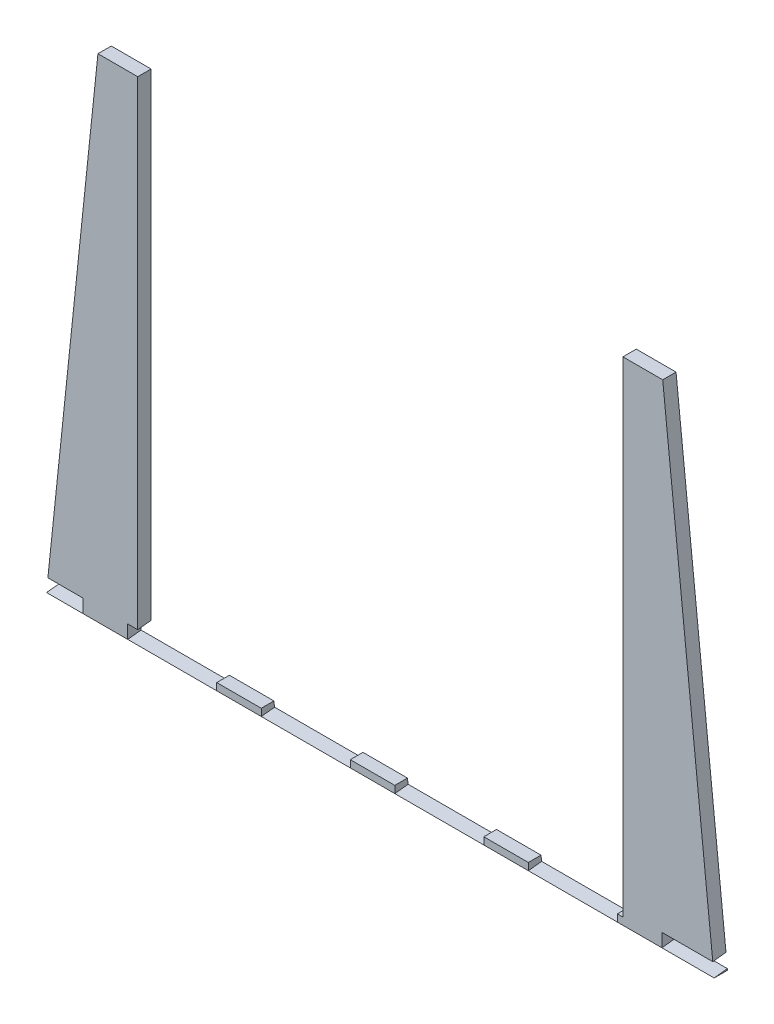
ISO-10303-21;
HEADER;
FILE_DESCRIPTION(('STEP AP214'),'2;1');
FILE_NAME('part.step','',(''),(''),'','','');
FILE_SCHEMA(('AUTOMOTIVE_DESIGN { 1 0 10303 214 1 1 1 1 }'));
ENDSEC;
DATA;
#1=APPLICATION_CONTEXT('core data for automotive mechanical design processes');
#2=APPLICATION_PROTOCOL_DEFINITION('international standard','automotive_design',2000,#1);
#3=PRODUCT_CONTEXT('',#1,'mechanical');
#4=PRODUCT('Part','Part','',(#3));
#5=PRODUCT_RELATED_PRODUCT_CATEGORY('part','',(#4));
#6=PRODUCT_DEFINITION_FORMATION('','',#4);
#7=PRODUCT_DEFINITION_CONTEXT('part definition',#1,'design');
#8=PRODUCT_DEFINITION('design','',#6,#7);
#9=PRODUCT_DEFINITION_SHAPE('','',#8);
#10=(LENGTH_UNIT() NAMED_UNIT(*) SI_UNIT(.MILLI.,.METRE.));
#11=(NAMED_UNIT(*) PLANE_ANGLE_UNIT() SI_UNIT($,.RADIAN.));
#12=(NAMED_UNIT(*) SI_UNIT($,.STERADIAN.) SOLID_ANGLE_UNIT());
#13=UNCERTAINTY_MEASURE_WITH_UNIT(LENGTH_MEASURE(1.E-05),#10,'distance_accuracy_value','');
#14=(GEOMETRIC_REPRESENTATION_CONTEXT(3) GLOBAL_UNCERTAINTY_ASSIGNED_CONTEXT((#13)) GLOBAL_UNIT_ASSIGNED_CONTEXT((#10,
#11,#12)) REPRESENTATION_CONTEXT('',''));
#15=CARTESIAN_POINT('',(0.,0.,0.));
#16=DIRECTION('',(0.,0.,1.));
#17=DIRECTION('',(1.,0.,0.));
#18=AXIS2_PLACEMENT_3D('',#15,#16,#17);
#19=CARTESIAN_POINT('',(-63.4385341207756,102.766276006913,3.));
#20=DIRECTION('',(0.994581264610143,-0.103962051184498,0.));
#21=DIRECTION('',(0.103962051184498,0.994581264610143,0.));
#22=AXIS2_PLACEMENT_3D('',#19,#20,#21);
#23=PLANE('',#22);
#24=DIRECTION('',(0.010925547496587,0.104522224426195,-0.994462536756865));
#25=VECTOR('',#24,1.);
#26=CARTESIAN_POINT('',(-74.5604818209624,-3.6348644337363,-8.30540048784391));
#27=LINE('',#26,#25);
#28=CARTESIAN_POINT('',(-74.684687294203,-4.82310990638334,3.));
#29=VERTEX_POINT('',#28);
#30=CARTESIAN_POINT('',(-74.6517281416172,-4.50779720058631,0.));
#31=VERTEX_POINT('',#30);
#32=EDGE_CURVE('E518',#29,#31,#27,.T.);
#33=ORIENTED_EDGE('',*,*,#32,.F.);
#34=DIRECTION('',(-0.103962051184498,-0.994581264610143,0.));
#35=VECTOR('',#34,1.);
#36=CARTESIAN_POINT('',(-63.4385341207756,102.766276006913,3.));
#37=LINE('',#36,#35);
#38=CARTESIAN_POINT('',(-63.4385341207756,102.766276006913,3.));
#39=VERTEX_POINT('',#38);
#40=EDGE_CURVE('E99',#39,#29,#37,.T.);
#41=ORIENTED_EDGE('',*,*,#40,.F.);
#42=DIRECTION('',(0.,0.,-1.));
#43=VECTOR('',#42,1.);
#44=CARTESIAN_POINT('',(-63.4385341207756,102.766276006913,3.));
#45=LINE('',#44,#43);
#46=CARTESIAN_POINT('',(-63.4385341207756,102.766276006913,0.));
#47=VERTEX_POINT('',#46);
#48=EDGE_CURVE('E177',#39,#47,#45,.T.);
#49=ORIENTED_EDGE('',*,*,#48,.T.);
#50=DIRECTION('',(-0.103962051184498,-0.994581264610143,0.));
#51=VECTOR('',#50,1.);
#52=CARTESIAN_POINT('',(-63.4385341207756,102.766276006913,0.));
#53=LINE('',#52,#51);
#54=EDGE_CURVE('E154',#47,#31,#53,.T.);
#55=ORIENTED_EDGE('',*,*,#54,.T.);
#56=EDGE_LOOP('',(#33,#41,#49,#55));
#57=FACE_BOUND('',#56,.T.);
#58=ADVANCED_FACE('F38',(#57),#23,.F.);
#59=CARTESIAN_POINT('',(75.,-7.83963474507401,3.));
#60=DIRECTION('',(-0.994581264610143,-0.103962051184498,0.));
#61=DIRECTION('',(0.103962051184498,-0.994581264610143,0.));
#62=AXIS2_PLACEMENT_3D('',#59,#60,#61);
#63=PLANE('',#62);
#64=DIRECTION('',(0.010925547496587,-0.104522224426195,0.994462536756865));
#65=VECTOR('',#64,1.);
#66=CARTESIAN_POINT('',(74.688169690649,-4.85642520000907,3.31697384545357));
#67=LINE('',#66,#65);
#68=CARTESIAN_POINT('',(74.6517281416172,-4.50779720058642,0.));
#69=VERTEX_POINT('',#68);
#70=CARTESIAN_POINT('',(74.684687294203,-4.82310990638346,3.));
#71=VERTEX_POINT('',#70);
#72=EDGE_CURVE('E511',#69,#71,#67,.T.);
#73=ORIENTED_EDGE('',*,*,#72,.F.);
#74=DIRECTION('',(-0.103962051184498,0.994581264610143,0.));
#75=VECTOR('',#74,1.);
#76=CARTESIAN_POINT('',(75.,-7.83963474507401,0.));
#77=LINE('',#76,#75);
#78=CARTESIAN_POINT('',(63.4385341207756,102.766276006913,0.));
#79=VERTEX_POINT('',#78);
#80=EDGE_CURVE('E159',#69,#79,#77,.T.);
#81=ORIENTED_EDGE('',*,*,#80,.T.);
#82=DIRECTION('',(0.,0.,-1.));
#83=VECTOR('',#82,1.);
#84=CARTESIAN_POINT('',(63.4385341207756,102.766276006913,3.));
#85=LINE('',#84,#83);
#86=CARTESIAN_POINT('',(63.4385341207756,102.766276006913,3.));
#87=VERTEX_POINT('',#86);
#88=EDGE_CURVE('E130',#87,#79,#85,.T.);
#89=ORIENTED_EDGE('',*,*,#88,.F.);
#90=DIRECTION('',(-0.103962051184498,0.994581264610143,0.));
#91=VECTOR('',#90,1.);
#92=CARTESIAN_POINT('',(75.,-7.83963474507401,3.));
#93=LINE('',#92,#91);
#94=EDGE_CURVE('E117',#71,#87,#93,.T.);
#95=ORIENTED_EDGE('',*,*,#94,.F.);
#96=EDGE_LOOP('',(#73,#81,#89,#95));
#97=FACE_BOUND('',#96,.T.);
#98=ADVANCED_FACE('F545',(#97),#63,.F.);
#99=CARTESIAN_POINT('',(54.5,102.766276006913,3.));
#100=DIRECTION('',(1.,0.,0.));
#101=DIRECTION('',(0.,0.,-1.));
#102=AXIS2_PLACEMENT_3D('',#99,#100,#101);
#103=PLANE('',#102);
#104=DIRECTION('',(0.,0.104528463267653,-0.994521895368273));
#105=VECTOR('',#104,1.);
#106=CARTESIAN_POINT('',(54.5,-3.64756679749241,-8.18454556963891));
#107=LINE('',#106,#105);
#108=CARTESIAN_POINT('',(54.5,-4.54248366916621,0.330019703698142));
#109=VERTEX_POINT('',#108);
#110=CARTESIAN_POINT('',(54.5,-4.50779720058641,0.));
#111=VERTEX_POINT('',#110);
#112=EDGE_CURVE('E236',#109,#111,#107,.T.);
#113=ORIENTED_EDGE('',*,*,#112,.F.);
#114=DIRECTION('',(0.,0.994521895368273,0.104528463267653));
#115=VECTOR('',#114,1.);
#116=CARTESIAN_POINT('',(54.5,101.871359135239,11.5145652733371));
#117=LINE('',#116,#115);
#118=CARTESIAN_POINT('',(54.5,-6.23372399308722,0.152263182801951));
#119=VERTEX_POINT('',#118);
#120=EDGE_CURVE('E153',#119,#109,#117,.T.);
#121=ORIENTED_EDGE('',*,*,#120,.F.);
#122=DIRECTION('',(0.,0.,-1.));
#123=VECTOR('',#122,1.);
#124=CARTESIAN_POINT('',(54.5,-6.23372399308722,3.));
#125=LINE('',#124,#123);
#126=CARTESIAN_POINT('',(54.5,-6.23372399308722,3.));
#127=VERTEX_POINT('',#126);
#128=EDGE_CURVE('E131',#127,#119,#125,.T.);
#129=ORIENTED_EDGE('',*,*,#128,.F.);
#130=DIRECTION('',(0.,-1.,0.));
#131=VECTOR('',#130,1.);
#132=CARTESIAN_POINT('',(54.5,102.766276006913,3.));
#133=LINE('',#132,#131);
#134=CARTESIAN_POINT('',(54.5,102.766276006913,3.));
#135=VERTEX_POINT('',#134);
#136=EDGE_CURVE('E113',#135,#127,#133,.T.);
#137=ORIENTED_EDGE('',*,*,#136,.F.);
#138=DIRECTION('',(0.,0.,-1.));
#139=VECTOR('',#138,1.);
#140=CARTESIAN_POINT('',(54.5,102.766276006913,3.));
#141=LINE('',#140,#139);
#142=CARTESIAN_POINT('',(54.5,102.766276006913,0.));
#143=VERTEX_POINT('',#142);
#144=EDGE_CURVE('E123',#135,#143,#141,.T.);
#145=ORIENTED_EDGE('',*,*,#144,.T.);
#146=DIRECTION('',(0.,-1.,0.));
#147=VECTOR('',#146,1.);
#148=CARTESIAN_POINT('',(54.5,102.766276006913,0.));
#149=LINE('',#148,#147);
#150=EDGE_CURVE('E164',#143,#111,#149,.T.);
#151=ORIENTED_EDGE('',*,*,#150,.T.);
#152=EDGE_LOOP('',(#113,#121,#129,#137,#145,#151));
#153=FACE_BOUND('',#152,.T.);
#154=ADVANCED_FACE('F134',(#153),#103,.F.);
#155=CARTESIAN_POINT('',(54.5,-6.23372399308722,3.));
#156=DIRECTION('',(0.,-1.,0.));
#157=DIRECTION('',(1.,0.,0.));
#158=AXIS2_PLACEMENT_3D('',#155,#156,#157);
#159=PLANE('',#158);
#160=DIRECTION('',(0.,0.,1.));
#161=VECTOR('',#160,1.);
#162=CARTESIAN_POINT('',(33.2500361211623,-6.23372399308722,3.));
#163=LINE('',#162,#161);
#164=CARTESIAN_POINT('',(33.2500361211623,-6.23372399308722,0.152263182801949));
#165=VERTEX_POINT('',#164);
#166=CARTESIAN_POINT('',(33.2500361211623,-6.23372399308723,3.));
#167=VERTEX_POINT('',#166);
#168=EDGE_CURVE('E237',#165,#167,#163,.T.);
#169=ORIENTED_EDGE('',*,*,#168,.F.);
#170=DIRECTION('',(1.,0.,0.));
#171=VECTOR('',#170,1.);
#172=CARTESIAN_POINT('',(54.5,-6.23372399308722,0.152263182801951));
#173=LINE('',#172,#171);
#174=CARTESIAN_POINT('',(23.2500361211622,-6.23372399308722,0.152263182801948));
#175=VERTEX_POINT('',#174);
#176=EDGE_CURVE('E12',#175,#165,#173,.T.);
#177=ORIENTED_EDGE('',*,*,#176,.F.);
#178=DIRECTION('',(0.,0.,-1.));
#179=VECTOR('',#178,1.);
#180=CARTESIAN_POINT('',(23.2500361211622,-6.23372399308723,3.));
#181=LINE('',#180,#179);
#182=CARTESIAN_POINT('',(23.2500361211622,-6.23372399308723,3.));
#183=VERTEX_POINT('',#182);
#184=EDGE_CURVE('E275',#183,#175,#181,.T.);
#185=ORIENTED_EDGE('',*,*,#184,.F.);
#186=DIRECTION('',(-1.,0.,0.));
#187=VECTOR('',#186,1.);
#188=CARTESIAN_POINT('',(54.5,-6.23372399308722,3.));
#189=LINE('',#188,#187);
#190=EDGE_CURVE('E146',#167,#183,#189,.T.);
#191=ORIENTED_EDGE('',*,*,#190,.F.);
#192=EDGE_LOOP('',(#169,#177,#185,#191));
#193=FACE_BOUND('',#192,.T.);
#194=ADVANCED_FACE('F284',(#193),#159,.F.);
#195=DIRECTION('',(0.,0.,-1.));
#196=VECTOR('',#195,1.);
#197=CARTESIAN_POINT('',(53.2500361211622,-6.23372399308722,3.));
#198=LINE('',#197,#196);
#199=CARTESIAN_POINT('',(53.2500361211622,-6.23372399308723,3.));
#200=VERTEX_POINT('',#199);
#201=CARTESIAN_POINT('',(53.2500361211622,-6.23372399308722,0.152263182801951));
#202=VERTEX_POINT('',#201);
#203=EDGE_CURVE('E242',#200,#202,#198,.T.);
#204=ORIENTED_EDGE('',*,*,#203,.F.);
#205=EDGE_CURVE('E143',#127,#200,#189,.T.);
#206=ORIENTED_EDGE('',*,*,#205,.F.);
#207=ORIENTED_EDGE('',*,*,#128,.T.);
#208=DIRECTION('',(1.,0.,0.));
#209=VECTOR('',#208,1.);
#210=CARTESIAN_POINT('',(54.5,-6.23372399308722,0.152263182801951));
#211=LINE('',#210,#209);
#212=EDGE_CURVE('E46',#202,#119,#211,.T.);
#213=ORIENTED_EDGE('',*,*,#212,.F.);
#214=EDGE_LOOP('',(#204,#206,#207,#213));
#215=FACE_BOUND('',#214,.T.);
#216=ADVANCED_FACE('F239',(#215),#159,.F.);
#217=DIRECTION('',(0.,0.,1.));
#218=VECTOR('',#217,1.);
#219=CARTESIAN_POINT('',(-26.7499638788378,-6.23372399308724,3.));
#220=LINE('',#219,#218);
#221=CARTESIAN_POINT('',(-26.7499638788378,-6.23372399308724,0.152263182801943));
#222=VERTEX_POINT('',#221);
#223=CARTESIAN_POINT('',(-26.7499638788377,-6.23372399308723,3.));
#224=VERTEX_POINT('',#223);
#225=EDGE_CURVE('E325',#222,#224,#220,.T.);
#226=ORIENTED_EDGE('',*,*,#225,.F.);
#227=DIRECTION('',(1.,0.,0.));
#228=VECTOR('',#227,1.);
#229=CARTESIAN_POINT('',(54.5,-6.23372399308722,0.152263182801951));
#230=LINE('',#229,#228);
#231=CARTESIAN_POINT('',(-36.7499638788377,-6.23372399308724,0.152263182801942));
#232=VERTEX_POINT('',#231);
#233=EDGE_CURVE('E217',#232,#222,#230,.T.);
#234=ORIENTED_EDGE('',*,*,#233,.F.);
#235=DIRECTION('',(0.,0.,-1.));
#236=VECTOR('',#235,1.);
#237=CARTESIAN_POINT('',(-36.7499638788377,-6.23372399308724,3.));
#238=LINE('',#237,#236);
#239=CARTESIAN_POINT('',(-36.7499638788377,-6.23372399308723,3.));
#240=VERTEX_POINT('',#239);
#241=EDGE_CURVE('E335',#240,#232,#238,.T.);
#242=ORIENTED_EDGE('',*,*,#241,.F.);
#243=EDGE_CURVE('E138',#224,#240,#189,.T.);
#244=ORIENTED_EDGE('',*,*,#243,.F.);
#245=EDGE_LOOP('',(#226,#234,#242,#244));
#246=FACE_BOUND('',#245,.T.);
#247=ADVANCED_FACE('F343',(#246),#159,.F.);
#248=DIRECTION('',(0.,0.,1.));
#249=VECTOR('',#248,1.);
#250=CARTESIAN_POINT('',(3.25003612116225,-6.23372399308723,3.));
#251=LINE('',#250,#249);
#252=CARTESIAN_POINT('',(3.25003612116225,-6.23372399308723,0.152263182801946));
#253=VERTEX_POINT('',#252);
#254=CARTESIAN_POINT('',(3.25003612116225,-6.23372399308723,3.));
#255=VERTEX_POINT('',#254);
#256=EDGE_CURVE('E305',#253,#255,#251,.T.);
#257=ORIENTED_EDGE('',*,*,#256,.F.);
#258=DIRECTION('',(1.,0.,0.));
#259=VECTOR('',#258,1.);
#260=CARTESIAN_POINT('',(54.5,-6.23372399308722,0.152263182801951));
#261=LINE('',#260,#259);
#262=CARTESIAN_POINT('',(-6.74996387883775,-6.23372399308723,0.152263182801945));
#263=VERTEX_POINT('',#262);
#264=EDGE_CURVE('E214',#263,#253,#261,.T.);
#265=ORIENTED_EDGE('',*,*,#264,.F.);
#266=DIRECTION('',(0.,0.,-1.));
#267=VECTOR('',#266,1.);
#268=CARTESIAN_POINT('',(-6.74996387883775,-6.23372399308723,3.));
#269=LINE('',#268,#267);
#270=CARTESIAN_POINT('',(-6.74996387883775,-6.23372399308723,3.));
#271=VERTEX_POINT('',#270);
#272=EDGE_CURVE('E307',#271,#263,#269,.T.);
#273=ORIENTED_EDGE('',*,*,#272,.F.);
#274=EDGE_CURVE('E141',#255,#271,#189,.T.);
#275=ORIENTED_EDGE('',*,*,#274,.F.);
#276=EDGE_LOOP('',(#257,#265,#273,#275));
#277=FACE_BOUND('',#276,.T.);
#278=ADVANCED_FACE('F302',(#277),#159,.F.);
#279=CARTESIAN_POINT('',(-54.5,-6.23372399308724,3.));
#280=DIRECTION('',(-1.,0.,0.));
#281=DIRECTION('',(0.,-1.,0.));
#282=AXIS2_PLACEMENT_3D('',#279,#280,#281);
#283=PLANE('',#282);
#284=DIRECTION('',(0.,-0.104528463267653,0.994521895368273));
#285=VECTOR('',#284,1.);
#286=CARTESIAN_POINT('',(-54.5,-4.83852255749995,3.14664157992898));
#287=LINE('',#286,#285);
#288=CARTESIAN_POINT('',(-54.5,-4.50779720058633,0.));
#289=VERTEX_POINT('',#288);
#290=CARTESIAN_POINT('',(-54.5,-4.82310990638336,3.));
#291=VERTEX_POINT('',#290);
#292=EDGE_CURVE('E515',#289,#291,#287,.T.);
#293=ORIENTED_EDGE('',*,*,#292,.F.);
#294=DIRECTION('',(0.,1.,0.));
#295=VECTOR('',#294,1.);
#296=CARTESIAN_POINT('',(-54.5,-6.23372399308724,0.));
#297=LINE('',#296,#295);
#298=CARTESIAN_POINT('',(-54.5,102.766276006913,0.));
#299=VERTEX_POINT('',#298);
#300=EDGE_CURVE('E90',#289,#299,#297,.T.);
#301=ORIENTED_EDGE('',*,*,#300,.T.);
#302=DIRECTION('',(0.,0.,-1.));
#303=VECTOR('',#302,1.);
#304=CARTESIAN_POINT('',(-54.5,102.766276006913,3.));
#305=LINE('',#304,#303);
#306=CARTESIAN_POINT('',(-54.5,102.766276006913,3.));
#307=VERTEX_POINT('',#306);
#308=EDGE_CURVE('E148',#307,#299,#305,.T.);
#309=ORIENTED_EDGE('',*,*,#308,.F.);
#310=DIRECTION('',(0.,1.,0.));
#311=VECTOR('',#310,1.);
#312=CARTESIAN_POINT('',(-54.5,-6.23372399308724,3.));
#313=LINE('',#312,#311);
#314=EDGE_CURVE('E62',#291,#307,#313,.T.);
#315=ORIENTED_EDGE('',*,*,#314,.F.);
#316=EDGE_LOOP('',(#293,#301,#309,#315));
#317=FACE_BOUND('',#316,.T.);
#318=ADVANCED_FACE('F530',(#317),#283,.F.);
#319=CARTESIAN_POINT('',(0.,0.,3.));
#320=DIRECTION('',(0.,0.,1.));
#321=DIRECTION('',(1.,0.,0.));
#322=AXIS2_PLACEMENT_3D('',#319,#320,#321);
#323=PLANE('',#322);
#324=DIRECTION('',(0.,1.,0.));
#325=VECTOR('',#324,1.);
#326=CARTESIAN_POINT('',(-56.7499638788377,0.,3.));
#327=LINE('',#326,#325);
#328=CARTESIAN_POINT('',(-56.7499638788377,-7.83963474507391,3.));
#329=VERTEX_POINT('',#328);
#330=CARTESIAN_POINT('',(-56.7499638788377,-4.82310990638336,3.));
#331=VERTEX_POINT('',#330);
#332=EDGE_CURVE('E211',#329,#331,#327,.T.);
#333=ORIENTED_EDGE('',*,*,#332,.T.);
#334=DIRECTION('',(1.,0.,0.));
#335=VECTOR('',#334,1.);
#336=CARTESIAN_POINT('',(0.,-4.8231099063834,3.));
#337=LINE('',#336,#335);
#338=EDGE_CURVE('E516',#331,#291,#337,.T.);
#339=ORIENTED_EDGE('',*,*,#338,.T.);
#340=ORIENTED_EDGE('',*,*,#314,.T.);
#341=DIRECTION('',(-1.,0.,0.));
#342=VECTOR('',#341,1.);
#343=CARTESIAN_POINT('',(-54.5,102.766276006913,3.));
#344=LINE('',#343,#342);
#345=EDGE_CURVE('E167',#307,#39,#344,.T.);
#346=ORIENTED_EDGE('',*,*,#345,.T.);
#347=ORIENTED_EDGE('',*,*,#40,.T.);
#348=CARTESIAN_POINT('',(-66.7499638788377,-4.82310990638335,3.));
#349=VERTEX_POINT('',#348);
#350=EDGE_CURVE('E459',#29,#349,#337,.T.);
#351=ORIENTED_EDGE('',*,*,#350,.T.);
#352=DIRECTION('',(0.,-1.,0.));
#353=VECTOR('',#352,1.);
#354=CARTESIAN_POINT('',(-66.7499638788377,0.,3.));
#355=LINE('',#354,#353);
#356=CARTESIAN_POINT('',(-66.7499638788377,-7.8396347450739,3.));
#357=VERTEX_POINT('',#356);
#358=EDGE_CURVE('E208',#349,#357,#355,.T.);
#359=ORIENTED_EDGE('',*,*,#358,.T.);
#360=DIRECTION('',(1.,0.,0.));
#361=VECTOR('',#360,1.);
#362=CARTESIAN_POINT('',(-75.,-7.83963474507401,3.));
#363=LINE('',#362,#361);
#364=EDGE_CURVE('E358',#357,#329,#363,.T.);
#365=ORIENTED_EDGE('',*,*,#364,.T.);
#366=EDGE_LOOP('',(#333,#339,#340,#346,#347,#351,#359,#365));
#367=FACE_BOUND('',#366,.T.);
#368=ADVANCED_FACE('F522',(#367),#323,.T.);
#369=CARTESIAN_POINT('',(23.2500361211622,-7.83963474507397,3.));
#370=VERTEX_POINT('',#369);
#371=CARTESIAN_POINT('',(33.2500361211623,-7.83963474507397,3.));
#372=VERTEX_POINT('',#371);
#373=EDGE_CURVE('E282',#370,#372,#363,.T.);
#374=ORIENTED_EDGE('',*,*,#373,.T.);
#375=DIRECTION('',(0.,1.,0.));
#376=VECTOR('',#375,1.);
#377=CARTESIAN_POINT('',(33.2500361211623,0.,3.));
#378=LINE('',#377,#376);
#379=EDGE_CURVE('E205',#372,#167,#378,.T.);
#380=ORIENTED_EDGE('',*,*,#379,.T.);
#381=ORIENTED_EDGE('',*,*,#190,.T.);
#382=DIRECTION('',(0.,-1.,0.));
#383=VECTOR('',#382,1.);
#384=CARTESIAN_POINT('',(23.2500361211623,0.,3.));
#385=LINE('',#384,#383);
#386=EDGE_CURVE('E202',#183,#370,#385,.T.);
#387=ORIENTED_EDGE('',*,*,#386,.T.);
#388=EDGE_LOOP('',(#374,#380,#381,#387));
#389=FACE_BOUND('',#388,.T.);
#390=ADVANCED_FACE('F280',(#389),#323,.T.);
#391=DIRECTION('',(0.,1.,0.));
#392=VECTOR('',#391,1.);
#393=CARTESIAN_POINT('',(63.2500361211622,0.,3.));
#394=LINE('',#393,#392);
#395=CARTESIAN_POINT('',(63.2500361211622,-7.839634745074,3.));
#396=VERTEX_POINT('',#395);
#397=CARTESIAN_POINT('',(63.2500361211622,-4.82310990638345,3.));
#398=VERTEX_POINT('',#397);
#399=EDGE_CURVE('E200',#396,#398,#394,.T.);
#400=ORIENTED_EDGE('',*,*,#399,.T.);
#401=EDGE_CURVE('E513',#398,#71,#337,.T.);
#402=ORIENTED_EDGE('',*,*,#401,.T.);
#403=ORIENTED_EDGE('',*,*,#94,.T.);
#404=DIRECTION('',(-1.,0.,0.));
#405=VECTOR('',#404,1.);
#406=CARTESIAN_POINT('',(63.4385341207756,102.766276006913,3.));
#407=LINE('',#406,#405);
#408=EDGE_CURVE('E107',#87,#135,#407,.T.);
#409=ORIENTED_EDGE('',*,*,#408,.T.);
#410=ORIENTED_EDGE('',*,*,#136,.T.);
#411=ORIENTED_EDGE('',*,*,#205,.T.);
#412=DIRECTION('',(0.,-1.,0.));
#413=VECTOR('',#412,1.);
#414=CARTESIAN_POINT('',(53.2500361211623,0.,3.));
#415=LINE('',#414,#413);
#416=CARTESIAN_POINT('',(53.2500361211622,-7.83963474507399,3.));
#417=VERTEX_POINT('',#416);
#418=EDGE_CURVE('E197',#200,#417,#415,.T.);
#419=ORIENTED_EDGE('',*,*,#418,.T.);
#420=EDGE_CURVE('E355',#417,#396,#363,.T.);
#421=ORIENTED_EDGE('',*,*,#420,.T.);
#422=EDGE_LOOP('',(#400,#402,#403,#409,#410,#411,#419,#421));
#423=FACE_BOUND('',#422,.T.);
#424=ADVANCED_FACE('F110',(#423),#323,.T.);
#425=CARTESIAN_POINT('',(-36.7499638788377,-7.83963474507392,3.));
#426=VERTEX_POINT('',#425);
#427=CARTESIAN_POINT('',(-26.7499638788378,-7.83963474507393,3.));
#428=VERTEX_POINT('',#427);
#429=EDGE_CURVE('E341',#426,#428,#363,.T.);
#430=ORIENTED_EDGE('',*,*,#429,.T.);
#431=DIRECTION('',(0.,1.,0.));
#432=VECTOR('',#431,1.);
#433=CARTESIAN_POINT('',(-26.7499638788377,0.,3.));
#434=LINE('',#433,#432);
#435=EDGE_CURVE('E194',#428,#224,#434,.T.);
#436=ORIENTED_EDGE('',*,*,#435,.T.);
#437=ORIENTED_EDGE('',*,*,#243,.T.);
#438=DIRECTION('',(0.,-1.,0.));
#439=VECTOR('',#438,1.);
#440=CARTESIAN_POINT('',(-36.7499638788377,0.,3.));
#441=LINE('',#440,#439);
#442=EDGE_CURVE('E191',#240,#426,#441,.T.);
#443=ORIENTED_EDGE('',*,*,#442,.T.);
#444=EDGE_LOOP('',(#430,#436,#437,#443));
#445=FACE_BOUND('',#444,.T.);
#446=ADVANCED_FACE('F339',(#445),#323,.T.);
#447=CARTESIAN_POINT('',(-6.74996387883775,-7.83963474507394,3.));
#448=VERTEX_POINT('',#447);
#449=CARTESIAN_POINT('',(3.25003612116225,-7.83963474507395,3.));
#450=VERTEX_POINT('',#449);
#451=EDGE_CURVE('E365',#448,#450,#363,.T.);
#452=ORIENTED_EDGE('',*,*,#451,.T.);
#453=DIRECTION('',(0.,1.,0.));
#454=VECTOR('',#453,1.);
#455=CARTESIAN_POINT('',(3.25003612116226,0.,3.));
#456=LINE('',#455,#454);
#457=EDGE_CURVE('E188',#450,#255,#456,.T.);
#458=ORIENTED_EDGE('',*,*,#457,.T.);
#459=ORIENTED_EDGE('',*,*,#274,.T.);
#460=DIRECTION('',(0.,-1.,0.));
#461=VECTOR('',#460,1.);
#462=CARTESIAN_POINT('',(-6.74996387883775,0.,3.));
#463=LINE('',#462,#461);
#464=EDGE_CURVE('E185',#271,#448,#463,.T.);
#465=ORIENTED_EDGE('',*,*,#464,.T.);
#466=EDGE_LOOP('',(#452,#458,#459,#465));
#467=FACE_BOUND('',#466,.T.);
#468=ADVANCED_FACE('F290',(#467),#323,.T.);
#469=CARTESIAN_POINT('',(0.,0.,0.));
#470=DIRECTION('',(0.,0.,1.));
#471=DIRECTION('',(1.,0.,0.));
#472=AXIS2_PLACEMENT_3D('',#469,#470,#471);
#473=PLANE('',#472);
#474=DIRECTION('',(1.,0.,0.));
#475=VECTOR('',#474,1.);
#476=CARTESIAN_POINT('',(0.,-4.50779720058637,0.));
#477=LINE('',#476,#475);
#478=EDGE_CURVE('E184',#31,#289,#477,.T.);
#479=ORIENTED_EDGE('',*,*,#478,.F.);
#480=ORIENTED_EDGE('',*,*,#54,.F.);
#481=DIRECTION('',(-1.,0.,0.));
#482=VECTOR('',#481,1.);
#483=CARTESIAN_POINT('',(-54.5,102.766276006913,0.));
#484=LINE('',#483,#482);
#485=EDGE_CURVE('E149',#299,#47,#484,.T.);
#486=ORIENTED_EDGE('',*,*,#485,.F.);
#487=ORIENTED_EDGE('',*,*,#300,.F.);
#488=EDGE_LOOP('',(#479,#480,#486,#487));
#489=FACE_BOUND('',#488,.T.);
#490=ADVANCED_FACE('F529',(#489),#473,.F.);
#491=EDGE_CURVE('E181',#111,#69,#477,.T.);
#492=ORIENTED_EDGE('',*,*,#491,.F.);
#493=ORIENTED_EDGE('',*,*,#150,.F.);
#494=DIRECTION('',(-1.,0.,0.));
#495=VECTOR('',#494,1.);
#496=CARTESIAN_POINT('',(63.4385341207756,102.766276006913,0.));
#497=LINE('',#496,#495);
#498=EDGE_CURVE('E126',#79,#143,#497,.T.);
#499=ORIENTED_EDGE('',*,*,#498,.F.);
#500=ORIENTED_EDGE('',*,*,#80,.F.);
#501=EDGE_LOOP('',(#492,#493,#499,#500));
#502=FACE_BOUND('',#501,.T.);
#503=ADVANCED_FACE('F535',(#502),#473,.F.);
#504=CARTESIAN_POINT('',(-54.5,102.766276006913,3.));
#505=DIRECTION('',(0.,-1.,0.));
#506=DIRECTION('',(1.,0.,0.));
#507=AXIS2_PLACEMENT_3D('',#504,#505,#506);
#508=PLANE('',#507);
#509=ORIENTED_EDGE('',*,*,#485,.T.);
#510=ORIENTED_EDGE('',*,*,#48,.F.);
#511=ORIENTED_EDGE('',*,*,#345,.F.);
#512=ORIENTED_EDGE('',*,*,#308,.T.);
#513=EDGE_LOOP('',(#509,#510,#511,#512));
#514=FACE_BOUND('',#513,.T.);
#515=ADVANCED_FACE('F40',(#514),#508,.F.);
#516=DIRECTION('',(0.,0.,-1.));
#517=VECTOR('',#516,1.);
#518=CARTESIAN_POINT('',(-75.,-7.83963474507401,3.));
#519=LINE('',#518,#517);
#520=CARTESIAN_POINT('',(-75.,-7.83963474507389,3.));
#521=VERTEX_POINT('',#520);
#522=CARTESIAN_POINT('',(-75.,-7.83963474507401,0.));
#523=VERTEX_POINT('',#522);
#524=EDGE_CURVE('E174',#521,#523,#519,.T.);
#525=ORIENTED_EDGE('',*,*,#524,.F.);
#526=DIRECTION('',(0.010925547496587,0.104522224426195,-0.994462536756865));
#527=VECTOR('',#526,1.);
#528=CARTESIAN_POINT('',(-74.8723121303134,-6.61807397880122,-8.62237433329748));
#529=LINE('',#528,#527);
#530=CARTESIAN_POINT('',(-74.9670408474143,-7.52432203927685,0.));
#531=VERTEX_POINT('',#530);
#532=EDGE_CURVE('E507',#521,#531,#529,.T.);
#533=ORIENTED_EDGE('',*,*,#532,.T.);
#534=EDGE_CURVE('E152',#531,#523,#53,.T.);
#535=ORIENTED_EDGE('',*,*,#534,.T.);
#536=EDGE_LOOP('',(#525,#533,#535));
#537=FACE_BOUND('',#536,.T.);
#538=ADVANCED_FACE('F534',(#537),#23,.F.);
#539=CARTESIAN_POINT('',(-75.,-7.83963474507401,3.));
#540=DIRECTION('',(0.,1.,0.));
#541=DIRECTION('',(0.,0.,1.));
#542=AXIS2_PLACEMENT_3D('',#539,#540,#541);
#543=PLANE('',#542);
#544=DIRECTION('',(1.,0.,0.));
#545=VECTOR('',#544,1.);
#546=CARTESIAN_POINT('',(-75.,-7.83963474507401,0.));
#547=LINE('',#546,#545);
#548=CARTESIAN_POINT('',(75.,-7.83963474507401,0.));
#549=VERTEX_POINT('',#548);
#550=EDGE_CURVE('E157',#523,#549,#547,.T.);
#551=ORIENTED_EDGE('',*,*,#550,.T.);
#552=DIRECTION('',(0.,0.,-1.));
#553=VECTOR('',#552,1.);
#554=CARTESIAN_POINT('',(75.,-7.83963474507401,3.));
#555=LINE('',#554,#553);
#556=CARTESIAN_POINT('',(75.,-7.83963474507401,3.));
#557=VERTEX_POINT('',#556);
#558=EDGE_CURVE('E171',#557,#549,#555,.T.);
#559=ORIENTED_EDGE('',*,*,#558,.F.);
#560=DIRECTION('',(-1.,0.,0.));
#561=VECTOR('',#560,1.);
#562=CARTESIAN_POINT('',(75.,-7.83963474507401,3.));
#563=LINE('',#562,#561);
#564=EDGE_CURVE('E502',#557,#396,#563,.T.);
#565=ORIENTED_EDGE('',*,*,#564,.T.);
#566=ORIENTED_EDGE('',*,*,#420,.F.);
#567=EDGE_CURVE('E505',#417,#372,#563,.T.);
#568=ORIENTED_EDGE('',*,*,#567,.T.);
#569=ORIENTED_EDGE('',*,*,#373,.F.);
#570=EDGE_CURVE('E376',#370,#450,#563,.T.);
#571=ORIENTED_EDGE('',*,*,#570,.T.);
#572=ORIENTED_EDGE('',*,*,#451,.F.);
#573=EDGE_CURVE('E374',#448,#428,#563,.T.);
#574=ORIENTED_EDGE('',*,*,#573,.T.);
#575=ORIENTED_EDGE('',*,*,#429,.F.);
#576=EDGE_CURVE('E499',#426,#329,#563,.T.);
#577=ORIENTED_EDGE('',*,*,#576,.T.);
#578=ORIENTED_EDGE('',*,*,#364,.F.);
#579=EDGE_CURVE('E356',#521,#357,#363,.T.);
#580=ORIENTED_EDGE('',*,*,#579,.F.);
#581=ORIENTED_EDGE('',*,*,#524,.T.);
#582=EDGE_LOOP('',(#551,#559,#565,#566,#568,#569,#571,#572,#574,#575,#577,#578,#580,#581));
#583=FACE_BOUND('',#582,.T.);
#584=ADVANCED_FACE('F372',(#583),#543,.F.);
#585=CARTESIAN_POINT('',(74.9670408474143,-7.52432203927697,0.));
#586=VERTEX_POINT('',#585);
#587=EDGE_CURVE('E160',#549,#586,#77,.T.);
#588=ORIENTED_EDGE('',*,*,#587,.T.);
#589=DIRECTION('',(0.010925547496587,-0.104522224426195,0.994462536756865));
#590=VECTOR('',#589,1.);
#591=CARTESIAN_POINT('',(75.,-7.839634745074,3.));
#592=LINE('',#591,#590);
#593=EDGE_CURVE('E53',#586,#557,#592,.T.);
#594=ORIENTED_EDGE('',*,*,#593,.T.);
#595=ORIENTED_EDGE('',*,*,#558,.T.);
#596=EDGE_LOOP('',(#588,#594,#595));
#597=FACE_BOUND('',#596,.T.);
#598=ADVANCED_FACE('F551',(#597),#63,.F.);
#599=CARTESIAN_POINT('',(63.4385341207756,102.766276006913,3.));
#600=DIRECTION('',(0.,-1.,0.));
#601=DIRECTION('',(0.,0.,-1.));
#602=AXIS2_PLACEMENT_3D('',#599,#600,#601);
#603=PLANE('',#602);
#604=ORIENTED_EDGE('',*,*,#498,.T.);
#605=ORIENTED_EDGE('',*,*,#144,.F.);
#606=ORIENTED_EDGE('',*,*,#408,.F.);
#607=ORIENTED_EDGE('',*,*,#88,.T.);
#608=EDGE_LOOP('',(#604,#605,#606,#607));
#609=FACE_BOUND('',#608,.T.);
#610=ADVANCED_FACE('F124',(#609),#603,.F.);
#611=ORIENTED_EDGE('',*,*,#534,.F.);
#612=DIRECTION('',(1.,0.,0.));
#613=VECTOR('',#612,1.);
#614=CARTESIAN_POINT('',(0.,-7.52432203927692,0.));
#615=LINE('',#614,#613);
#616=EDGE_CURVE('E179',#531,#586,#615,.T.);
#617=ORIENTED_EDGE('',*,*,#616,.T.);
#618=ORIENTED_EDGE('',*,*,#587,.F.);
#619=ORIENTED_EDGE('',*,*,#550,.F.);
#620=EDGE_LOOP('',(#611,#617,#618,#619));
#621=FACE_BOUND('',#620,.T.);
#622=ADVANCED_FACE('F543',(#621),#473,.F.);
#623=CARTESIAN_POINT('',(23.2500361211622,-7.52604935527101,0.0164343138951834));
#624=DIRECTION('',(0.,0.104528463267653,-0.994521895368273));
#625=DIRECTION('',(-1.,0.,0.));
#626=AXIS2_PLACEMENT_3D('',#623,#624,#625);
#627=PLANE('',#626);
#628=ORIENTED_EDGE('',*,*,#176,.T.);
#629=DIRECTION('',(0.,0.994521895368273,0.104528463267653));
#630=VECTOR('',#629,1.);
#631=CARTESIAN_POINT('',(33.2500361211623,-7.52604935527101,0.0164343138951834));
#632=LINE('',#631,#630);
#633=CARTESIAN_POINT('',(33.2500361211623,-7.52604935527101,0.0164343138951834));
#634=VERTEX_POINT('',#633);
#635=EDGE_CURVE('E271',#634,#165,#632,.T.);
#636=ORIENTED_EDGE('',*,*,#635,.F.);
#637=DIRECTION('',(-1.,0.,0.));
#638=VECTOR('',#637,1.);
#639=CARTESIAN_POINT('',(23.2500361211622,-7.52604935527101,0.0164343138951834));
#640=LINE('',#639,#638);
#641=CARTESIAN_POINT('',(23.2500361211622,-7.52604935527101,0.0164343138951834));
#642=VERTEX_POINT('',#641);
#643=EDGE_CURVE('E648',#634,#642,#640,.T.);
#644=ORIENTED_EDGE('',*,*,#643,.T.);
#645=DIRECTION('',(0.,0.994521895368273,0.104528463267653));
#646=VECTOR('',#645,1.);
#647=CARTESIAN_POINT('',(23.2500361211622,-7.52604935527101,0.0164343138951834));
#648=LINE('',#647,#646);
#649=EDGE_CURVE('E654',#642,#175,#648,.T.);
#650=ORIENTED_EDGE('',*,*,#649,.T.);
#651=EDGE_LOOP('',(#628,#636,#644,#650));
#652=FACE_BOUND('',#651,.T.);
#653=ADVANCED_FACE('F566',(#652),#627,.T.);
#654=CARTESIAN_POINT('',(53.2500361211622,-7.52604935527103,0.0164343138951834));
#655=DIRECTION('',(0.,0.104528463267653,-0.994521895368273));
#656=DIRECTION('',(-1.,0.,0.));
#657=AXIS2_PLACEMENT_3D('',#654,#655,#656);
#658=PLANE('',#657);
#659=ORIENTED_EDGE('',*,*,#120,.T.);
#660=DIRECTION('',(-1.,0.,0.));
#661=VECTOR('',#660,1.);
#662=CARTESIAN_POINT('',(53.2500361211622,-4.54248366916621,0.330019703698142));
#663=LINE('',#662,#661);
#664=CARTESIAN_POINT('',(63.2500361211622,-4.54248366916622,0.330019703698142));
#665=VERTEX_POINT('',#664);
#666=EDGE_CURVE('E639',#665,#109,#663,.T.);
#667=ORIENTED_EDGE('',*,*,#666,.F.);
#668=DIRECTION('',(0.,0.994521895368273,0.104528463267653));
#669=VECTOR('',#668,1.);
#670=CARTESIAN_POINT('',(63.2500361211622,-7.52604935527104,0.0164343138951834));
#671=LINE('',#670,#669);
#672=CARTESIAN_POINT('',(63.2500361211622,-7.52604935527104,0.0164343138951834));
#673=VERTEX_POINT('',#672);
#674=EDGE_CURVE('E627',#673,#665,#671,.T.);
#675=ORIENTED_EDGE('',*,*,#674,.F.);
#676=DIRECTION('',(-1.,0.,0.));
#677=VECTOR('',#676,1.);
#678=CARTESIAN_POINT('',(53.2500361211622,-7.52604935527103,0.0164343138951834));
#679=LINE('',#678,#677);
#680=CARTESIAN_POINT('',(53.2500361211622,-7.52604935527103,0.0164343138951834));
#681=VERTEX_POINT('',#680);
#682=EDGE_CURVE('E631',#673,#681,#679,.T.);
#683=ORIENTED_EDGE('',*,*,#682,.T.);
#684=DIRECTION('',(0.,0.994521895368273,0.104528463267653));
#685=VECTOR('',#684,1.);
#686=CARTESIAN_POINT('',(53.2500361211622,-7.52604935527103,0.0164343138951834));
#687=LINE('',#686,#685);
#688=EDGE_CURVE('E231',#681,#202,#687,.T.);
#689=ORIENTED_EDGE('',*,*,#688,.T.);
#690=ORIENTED_EDGE('',*,*,#212,.T.);
#691=EDGE_LOOP('',(#659,#667,#675,#683,#689,#690));
#692=FACE_BOUND('',#691,.T.);
#693=ADVANCED_FACE('F224',(#692),#658,.T.);
#694=CARTESIAN_POINT('',(-36.7499638788377,-7.52604935527096,0.0164343138951834));
#695=DIRECTION('',(0.,0.104528463267653,-0.994521895368273));
#696=DIRECTION('',(-1.,0.,0.));
#697=AXIS2_PLACEMENT_3D('',#694,#695,#696);
#698=PLANE('',#697);
#699=ORIENTED_EDGE('',*,*,#233,.T.);
#700=DIRECTION('',(0.,0.994521895368273,0.104528463267653));
#701=VECTOR('',#700,1.);
#702=CARTESIAN_POINT('',(-26.7499638788378,-7.52604935527097,0.0164343138951834));
#703=LINE('',#702,#701);
#704=CARTESIAN_POINT('',(-26.7499638788378,-7.52604935527097,0.0164343138951834));
#705=VERTEX_POINT('',#704);
#706=EDGE_CURVE('E331',#705,#222,#703,.T.);
#707=ORIENTED_EDGE('',*,*,#706,.F.);
#708=DIRECTION('',(-1.,0.,0.));
#709=VECTOR('',#708,1.);
#710=CARTESIAN_POINT('',(-36.7499638788377,-7.52604935527096,0.0164343138951834));
#711=LINE('',#710,#709);
#712=CARTESIAN_POINT('',(-36.7499638788377,-7.52604935527096,0.0164343138951834));
#713=VERTEX_POINT('',#712);
#714=EDGE_CURVE('E467',#705,#713,#711,.T.);
#715=ORIENTED_EDGE('',*,*,#714,.T.);
#716=DIRECTION('',(0.,0.994521895368273,0.104528463267653));
#717=VECTOR('',#716,1.);
#718=CARTESIAN_POINT('',(-36.7499638788377,-7.52604935527096,0.0164343138951834));
#719=LINE('',#718,#717);
#720=EDGE_CURVE('E477',#713,#232,#719,.T.);
#721=ORIENTED_EDGE('',*,*,#720,.T.);
#722=EDGE_LOOP('',(#699,#707,#715,#721));
#723=FACE_BOUND('',#722,.T.);
#724=ADVANCED_FACE('F594',(#723),#698,.T.);
#725=CARTESIAN_POINT('',(-6.74996387883775,-7.52604935527098,0.0164343138951834));
#726=DIRECTION('',(0.,0.104528463267653,-0.994521895368273));
#727=DIRECTION('',(-1.,0.,0.));
#728=AXIS2_PLACEMENT_3D('',#725,#726,#727);
#729=PLANE('',#728);
#730=ORIENTED_EDGE('',*,*,#264,.T.);
#731=DIRECTION('',(0.,0.994521895368273,0.104528463267653));
#732=VECTOR('',#731,1.);
#733=CARTESIAN_POINT('',(3.25003612116225,-7.52604935527099,0.0164343138951834));
#734=LINE('',#733,#732);
#735=CARTESIAN_POINT('',(3.25003612116225,-7.52604935527099,0.0164343138951834));
#736=VERTEX_POINT('',#735);
#737=EDGE_CURVE('E465',#736,#253,#734,.T.);
#738=ORIENTED_EDGE('',*,*,#737,.F.);
#739=DIRECTION('',(-1.,0.,0.));
#740=VECTOR('',#739,1.);
#741=CARTESIAN_POINT('',(-6.74996387883775,-7.52604935527098,0.0164343138951834));
#742=LINE('',#741,#740);
#743=CARTESIAN_POINT('',(-6.74996387883775,-7.52604935527098,0.0164343138951834));
#744=VERTEX_POINT('',#743);
#745=EDGE_CURVE('E463',#736,#744,#742,.T.);
#746=ORIENTED_EDGE('',*,*,#745,.T.);
#747=DIRECTION('',(0.,0.994521895368273,0.104528463267653));
#748=VECTOR('',#747,1.);
#749=CARTESIAN_POINT('',(-6.74996387883775,-7.52604935527098,0.0164343138951834));
#750=LINE('',#749,#748);
#751=EDGE_CURVE('E457',#744,#263,#750,.T.);
#752=ORIENTED_EDGE('',*,*,#751,.T.);
#753=EDGE_LOOP('',(#730,#738,#746,#752));
#754=FACE_BOUND('',#753,.T.);
#755=ADVANCED_FACE('F461',(#754),#729,.T.);
#756=CARTESIAN_POINT('',(33.2500361211623,-7.52604935527101,0.0164343138951834));
#757=DIRECTION('',(1.,0.,0.));
#758=DIRECTION('',(0.,0.104528463267653,-0.994521895368273));
#759=AXIS2_PLACEMENT_3D('',#756,#757,#758);
#760=PLANE('',#759);
#761=ORIENTED_EDGE('',*,*,#168,.T.);
#762=ORIENTED_EDGE('',*,*,#379,.F.);
#763=DIRECTION('',(0.,0.104528463267653,-0.994521895368273));
#764=VECTOR('',#763,1.);
#765=CARTESIAN_POINT('',(33.2500361211623,-7.52604935527101,0.0164343138951834));
#766=LINE('',#765,#764);
#767=EDGE_CURVE('E626',#372,#634,#766,.T.);
#768=ORIENTED_EDGE('',*,*,#767,.T.);
#769=ORIENTED_EDGE('',*,*,#635,.T.);
#770=EDGE_LOOP('',(#761,#762,#768,#769));
#771=FACE_BOUND('',#770,.T.);
#772=ADVANCED_FACE('F266',(#771),#760,.T.);
#773=CARTESIAN_POINT('',(23.2500361211622,-7.83963474507397,3.));
#774=DIRECTION('',(-1.,0.,0.));
#775=DIRECTION('',(0.,-0.104528463267653,0.994521895368273));
#776=AXIS2_PLACEMENT_3D('',#773,#774,#775);
#777=PLANE('',#776);
#778=ORIENTED_EDGE('',*,*,#184,.T.);
#779=ORIENTED_EDGE('',*,*,#649,.F.);
#780=DIRECTION('',(0.,-0.104528463267653,0.994521895368273));
#781=VECTOR('',#780,1.);
#782=CARTESIAN_POINT('',(23.2500361211622,-7.83963474507397,3.));
#783=LINE('',#782,#781);
#784=EDGE_CURVE('E651',#642,#370,#783,.T.);
#785=ORIENTED_EDGE('',*,*,#784,.T.);
#786=ORIENTED_EDGE('',*,*,#386,.F.);
#787=EDGE_LOOP('',(#778,#779,#785,#786));
#788=FACE_BOUND('',#787,.T.);
#789=ADVANCED_FACE('F609',(#788),#777,.T.);
#790=CARTESIAN_POINT('',(53.2500361211622,-7.83963474507399,3.));
#791=DIRECTION('',(-1.,0.,0.));
#792=DIRECTION('',(0.,-0.104528463267653,0.994521895368273));
#793=AXIS2_PLACEMENT_3D('',#790,#791,#792);
#794=PLANE('',#793);
#795=ORIENTED_EDGE('',*,*,#203,.T.);
#796=ORIENTED_EDGE('',*,*,#688,.F.);
#797=DIRECTION('',(0.,-0.104528463267653,0.994521895368273));
#798=VECTOR('',#797,1.);
#799=CARTESIAN_POINT('',(53.2500361211622,-7.83963474507399,3.));
#800=LINE('',#799,#798);
#801=EDGE_CURVE('E624',#681,#417,#800,.T.);
#802=ORIENTED_EDGE('',*,*,#801,.T.);
#803=ORIENTED_EDGE('',*,*,#418,.F.);
#804=EDGE_LOOP('',(#795,#796,#802,#803));
#805=FACE_BOUND('',#804,.T.);
#806=ADVANCED_FACE('F593',(#805),#794,.T.);
#807=CARTESIAN_POINT('',(-26.7499638788378,-7.52604935527097,0.0164343138951834));
#808=DIRECTION('',(1.,0.,0.));
#809=DIRECTION('',(0.,0.104528463267653,-0.994521895368273));
#810=AXIS2_PLACEMENT_3D('',#807,#808,#809);
#811=PLANE('',#810);
#812=ORIENTED_EDGE('',*,*,#225,.T.);
#813=ORIENTED_EDGE('',*,*,#435,.F.);
#814=DIRECTION('',(0.,0.104528463267653,-0.994521895368273));
#815=VECTOR('',#814,1.);
#816=CARTESIAN_POINT('',(-26.7499638788378,-7.52604935527097,0.0164343138951834));
#817=LINE('',#816,#815);
#818=EDGE_CURVE('E464',#428,#705,#817,.T.);
#819=ORIENTED_EDGE('',*,*,#818,.T.);
#820=ORIENTED_EDGE('',*,*,#706,.T.);
#821=EDGE_LOOP('',(#812,#813,#819,#820));
#822=FACE_BOUND('',#821,.T.);
#823=ADVANCED_FACE('F326',(#822),#811,.T.);
#824=CARTESIAN_POINT('',(-36.7499638788377,-7.83963474507392,3.));
#825=DIRECTION('',(-1.,0.,0.));
#826=DIRECTION('',(0.,-0.104528463267653,0.994521895368273));
#827=AXIS2_PLACEMENT_3D('',#824,#825,#826);
#828=PLANE('',#827);
#829=ORIENTED_EDGE('',*,*,#241,.T.);
#830=ORIENTED_EDGE('',*,*,#720,.F.);
#831=DIRECTION('',(0.,-0.104528463267653,0.994521895368273));
#832=VECTOR('',#831,1.);
#833=CARTESIAN_POINT('',(-36.7499638788377,-7.83963474507392,3.));
#834=LINE('',#833,#832);
#835=EDGE_CURVE('E475',#713,#426,#834,.T.);
#836=ORIENTED_EDGE('',*,*,#835,.T.);
#837=ORIENTED_EDGE('',*,*,#442,.F.);
#838=EDGE_LOOP('',(#829,#830,#836,#837));
#839=FACE_BOUND('',#838,.T.);
#840=ADVANCED_FACE('F592',(#839),#828,.T.);
#841=CARTESIAN_POINT('',(3.25003612116225,-7.52604935527099,0.0164343138951834));
#842=DIRECTION('',(1.,0.,0.));
#843=DIRECTION('',(0.,0.104528463267653,-0.994521895368273));
#844=AXIS2_PLACEMENT_3D('',#841,#842,#843);
#845=PLANE('',#844);
#846=ORIENTED_EDGE('',*,*,#256,.T.);
#847=ORIENTED_EDGE('',*,*,#457,.F.);
#848=DIRECTION('',(0.,0.104528463267653,-0.994521895368273));
#849=VECTOR('',#848,1.);
#850=CARTESIAN_POINT('',(3.25003612116225,-7.52604935527099,0.0164343138951834));
#851=LINE('',#850,#849);
#852=EDGE_CURVE('E657',#450,#736,#851,.T.);
#853=ORIENTED_EDGE('',*,*,#852,.T.);
#854=ORIENTED_EDGE('',*,*,#737,.T.);
#855=EDGE_LOOP('',(#846,#847,#853,#854));
#856=FACE_BOUND('',#855,.T.);
#857=ADVANCED_FACE('F600',(#856),#845,.T.);
#858=CARTESIAN_POINT('',(-6.74996387883775,-7.83963474507394,3.));
#859=DIRECTION('',(-1.,0.,0.));
#860=DIRECTION('',(0.,-0.104528463267653,0.994521895368273));
#861=AXIS2_PLACEMENT_3D('',#858,#859,#860);
#862=PLANE('',#861);
#863=ORIENTED_EDGE('',*,*,#272,.T.);
#864=ORIENTED_EDGE('',*,*,#751,.F.);
#865=DIRECTION('',(0.,-0.104528463267653,0.994521895368273));
#866=VECTOR('',#865,1.);
#867=CARTESIAN_POINT('',(-6.74996387883775,-7.83963474507394,3.));
#868=LINE('',#867,#866);
#869=EDGE_CURVE('E383',#744,#448,#868,.T.);
#870=ORIENTED_EDGE('',*,*,#869,.T.);
#871=ORIENTED_EDGE('',*,*,#464,.F.);
#872=EDGE_LOOP('',(#863,#864,#870,#871));
#873=FACE_BOUND('',#872,.T.);
#874=ADVANCED_FACE('F456',(#873),#862,.T.);
#875=CARTESIAN_POINT('',(0.,2.98356568610488,-71.2755567628175));
#876=DIRECTION('',(0.,-0.994521895368273,-0.104528463267653));
#877=DIRECTION('',(0.,0.104528463267653,-0.994521895368273));
#878=AXIS2_PLACEMENT_3D('',#875,#876,#877);
#879=PLANE('',#878);
#880=ORIENTED_EDGE('',*,*,#32,.T.);
#881=ORIENTED_EDGE('',*,*,#478,.T.);
#882=ORIENTED_EDGE('',*,*,#292,.T.);
#883=ORIENTED_EDGE('',*,*,#338,.F.);
#884=DIRECTION('',(0.,0.104528463267653,-0.994521895368273));
#885=VECTOR('',#884,1.);
#886=CARTESIAN_POINT('',(-56.7499638788377,-4.54248366916613,0.330019703698142));
#887=LINE('',#886,#885);
#888=CARTESIAN_POINT('',(-56.7499638788377,-4.54248366916613,0.330019703698142));
#889=VERTEX_POINT('',#888);
#890=EDGE_CURVE('E479',#331,#889,#887,.T.);
#891=ORIENTED_EDGE('',*,*,#890,.T.);
#892=DIRECTION('',(-1.,0.,0.));
#893=VECTOR('',#892,1.);
#894=CARTESIAN_POINT('',(-66.7499638788377,-4.54248366916612,0.330019703698142));
#895=LINE('',#894,#893);
#896=CARTESIAN_POINT('',(-66.7499638788377,-4.54248366916612,0.330019703698142));
#897=VERTEX_POINT('',#896);
#898=EDGE_CURVE('E492',#889,#897,#895,.T.);
#899=ORIENTED_EDGE('',*,*,#898,.T.);
#900=DIRECTION('',(0.,-0.104528463267653,0.994521895368273));
#901=VECTOR('',#900,1.);
#902=CARTESIAN_POINT('',(-66.7499638788377,-4.85606905896908,3.31358538980296));
#903=LINE('',#902,#901);
#904=EDGE_CURVE('E485',#897,#349,#903,.T.);
#905=ORIENTED_EDGE('',*,*,#904,.T.);
#906=ORIENTED_EDGE('',*,*,#350,.F.);
#907=EDGE_LOOP('',(#880,#881,#882,#883,#891,#899,#905,#906));
#908=FACE_BOUND('',#907,.T.);
#909=ADVANCED_FACE('F524',(#908),#879,.T.);
#910=CARTESIAN_POINT('',(0.,0.,-71.5891421526205));
#911=DIRECTION('',(0.,-0.994521895368273,-0.104528463267653));
#912=DIRECTION('',(0.,0.104528463267653,-0.994521895368273));
#913=AXIS2_PLACEMENT_3D('',#910,#911,#912);
#914=PLANE('',#913);
#915=ORIENTED_EDGE('',*,*,#579,.T.);
#916=DIRECTION('',(0.,-0.104528463267653,0.994521895368273));
#917=VECTOR('',#916,1.);
#918=CARTESIAN_POINT('',(-66.7499638788377,-7.8396347450739,3.));
#919=LINE('',#918,#917);
#920=CARTESIAN_POINT('',(-66.7499638788377,-7.52604935527094,0.0164343138951834));
#921=VERTEX_POINT('',#920);
#922=EDGE_CURVE('E488',#921,#357,#919,.T.);
#923=ORIENTED_EDGE('',*,*,#922,.F.);
#924=DIRECTION('',(-1.,0.,0.));
#925=VECTOR('',#924,1.);
#926=CARTESIAN_POINT('',(-66.7499638788377,-7.52604935527094,0.0164343138951834));
#927=LINE('',#926,#925);
#928=CARTESIAN_POINT('',(-56.7499638788377,-7.52604935527095,0.0164343138951834));
#929=VERTEX_POINT('',#928);
#930=EDGE_CURVE('E484',#929,#921,#927,.T.);
#931=ORIENTED_EDGE('',*,*,#930,.F.);
#932=DIRECTION('',(0.,0.104528463267653,-0.994521895368273));
#933=VECTOR('',#932,1.);
#934=CARTESIAN_POINT('',(-56.7499638788377,-7.52604935527095,0.0164343138951834));
#935=LINE('',#934,#933);
#936=EDGE_CURVE('E481',#329,#929,#935,.T.);
#937=ORIENTED_EDGE('',*,*,#936,.F.);
#938=ORIENTED_EDGE('',*,*,#576,.F.);
#939=ORIENTED_EDGE('',*,*,#835,.F.);
#940=ORIENTED_EDGE('',*,*,#714,.F.);
#941=ORIENTED_EDGE('',*,*,#818,.F.);
#942=ORIENTED_EDGE('',*,*,#573,.F.);
#943=ORIENTED_EDGE('',*,*,#869,.F.);
#944=ORIENTED_EDGE('',*,*,#745,.F.);
#945=ORIENTED_EDGE('',*,*,#852,.F.);
#946=ORIENTED_EDGE('',*,*,#570,.F.);
#947=ORIENTED_EDGE('',*,*,#784,.F.);
#948=ORIENTED_EDGE('',*,*,#643,.F.);
#949=ORIENTED_EDGE('',*,*,#767,.F.);
#950=ORIENTED_EDGE('',*,*,#567,.F.);
#951=ORIENTED_EDGE('',*,*,#801,.F.);
#952=ORIENTED_EDGE('',*,*,#682,.F.);
#953=DIRECTION('',(0.,0.104528463267653,-0.994521895368273));
#954=VECTOR('',#953,1.);
#955=CARTESIAN_POINT('',(63.2500361211622,-7.52604935527104,0.0164343138951834));
#956=LINE('',#955,#954);
#957=EDGE_CURVE('E636',#396,#673,#956,.T.);
#958=ORIENTED_EDGE('',*,*,#957,.F.);
#959=ORIENTED_EDGE('',*,*,#564,.F.);
#960=ORIENTED_EDGE('',*,*,#593,.F.);
#961=ORIENTED_EDGE('',*,*,#616,.F.);
#962=ORIENTED_EDGE('',*,*,#532,.F.);
#963=EDGE_LOOP('',(#915,#923,#931,#937,#938,#939,#940,#941,#942,#943,#944,#945,#946,#947,#948,
#949,#950,#951,#952,#958,#959,#960,#961,#962));
#964=FACE_BOUND('',#963,.T.);
#965=ADVANCED_FACE('F570',(#964),#914,.F.);
#966=DIRECTION('',(0.,0.104528463267653,-0.994521895368273));
#967=VECTOR('',#966,1.);
#968=CARTESIAN_POINT('',(63.2500361211622,-4.54248366916622,0.330019703698142));
#969=LINE('',#968,#967);
#970=EDGE_CURVE('E642',#398,#665,#969,.T.);
#971=ORIENTED_EDGE('',*,*,#970,.T.);
#972=ORIENTED_EDGE('',*,*,#666,.T.);
#973=ORIENTED_EDGE('',*,*,#112,.T.);
#974=ORIENTED_EDGE('',*,*,#491,.T.);
#975=ORIENTED_EDGE('',*,*,#72,.T.);
#976=ORIENTED_EDGE('',*,*,#401,.F.);
#977=EDGE_LOOP('',(#971,#972,#973,#974,#975,#976));
#978=FACE_BOUND('',#977,.T.);
#979=ADVANCED_FACE('F573',(#978),#879,.T.);
#980=CARTESIAN_POINT('',(-56.7499638788377,-7.52604935527095,0.0164343138951834));
#981=DIRECTION('',(1.,0.,0.));
#982=DIRECTION('',(0.,0.104528463267653,-0.994521895368273));
#983=AXIS2_PLACEMENT_3D('',#980,#981,#982);
#984=PLANE('',#983);
#985=ORIENTED_EDGE('',*,*,#936,.T.);
#986=DIRECTION('',(0.,0.994521895368273,0.104528463267653));
#987=VECTOR('',#986,1.);
#988=CARTESIAN_POINT('',(-56.7499638788377,-7.52604935527095,0.0164343138951834));
#989=LINE('',#988,#987);
#990=EDGE_CURVE('E490',#929,#889,#989,.T.);
#991=ORIENTED_EDGE('',*,*,#990,.T.);
#992=ORIENTED_EDGE('',*,*,#890,.F.);
#993=ORIENTED_EDGE('',*,*,#332,.F.);
#994=EDGE_LOOP('',(#985,#991,#992,#993));
#995=FACE_BOUND('',#994,.T.);
#996=ADVANCED_FACE('F576',(#995),#984,.T.);
#997=CARTESIAN_POINT('',(-66.7499638788377,-7.8396347450739,3.));
#998=DIRECTION('',(-1.,0.,0.));
#999=DIRECTION('',(0.,-0.104528463267653,0.994521895368273));
#1000=AXIS2_PLACEMENT_3D('',#997,#998,#999);
#1001=PLANE('',#1000);
#1002=ORIENTED_EDGE('',*,*,#904,.F.);
#1003=DIRECTION('',(0.,0.994521895368273,0.104528463267653));
#1004=VECTOR('',#1003,1.);
#1005=CARTESIAN_POINT('',(-66.7499638788377,-7.52604935527094,0.0164343138951834));
#1006=LINE('',#1005,#1004);
#1007=EDGE_CURVE('E497',#921,#897,#1006,.T.);
#1008=ORIENTED_EDGE('',*,*,#1007,.F.);
#1009=ORIENTED_EDGE('',*,*,#922,.T.);
#1010=ORIENTED_EDGE('',*,*,#358,.F.);
#1011=EDGE_LOOP('',(#1002,#1008,#1009,#1010));
#1012=FACE_BOUND('',#1011,.T.);
#1013=ADVANCED_FACE('F580',(#1012),#1001,.T.);
#1014=CARTESIAN_POINT('',(-66.7499638788377,-7.52604935527094,0.0164343138951834));
#1015=DIRECTION('',(0.,0.104528463267653,-0.994521895368273));
#1016=DIRECTION('',(-1.,0.,0.));
#1017=AXIS2_PLACEMENT_3D('',#1014,#1015,#1016);
#1018=PLANE('',#1017);
#1019=ORIENTED_EDGE('',*,*,#898,.F.);
#1020=ORIENTED_EDGE('',*,*,#990,.F.);
#1021=ORIENTED_EDGE('',*,*,#930,.T.);
#1022=ORIENTED_EDGE('',*,*,#1007,.T.);
#1023=EDGE_LOOP('',(#1019,#1020,#1021,#1022));
#1024=FACE_BOUND('',#1023,.T.);
#1025=ADVANCED_FACE('F582',(#1024),#1018,.T.);
#1026=CARTESIAN_POINT('',(63.2500361211622,-7.52604935527104,0.0164343138951834));
#1027=DIRECTION('',(1.,0.,0.));
#1028=DIRECTION('',(0.,0.104528463267653,-0.994521895368273));
#1029=AXIS2_PLACEMENT_3D('',#1026,#1027,#1028);
#1030=PLANE('',#1029);
#1031=ORIENTED_EDGE('',*,*,#957,.T.);
#1032=ORIENTED_EDGE('',*,*,#674,.T.);
#1033=ORIENTED_EDGE('',*,*,#970,.F.);
#1034=ORIENTED_EDGE('',*,*,#399,.F.);
#1035=EDGE_LOOP('',(#1031,#1032,#1033,#1034));
#1036=FACE_BOUND('',#1035,.T.);
#1037=ADVANCED_FACE('F585',(#1036),#1030,.T.);
#1038=CLOSED_SHELL('',(#58,#98,#154,#194,#216,#247,#278,#318,#368,#390,#424,#446,#468,#490,#503,
#515,#538,#584,#598,#610,#622,#653,#693,#724,#755,#772,#789,#806,#823,#840,#857,#874,#909,#965,
#979,#996,#1013,#1025,#1037));
#1039=MANIFOLD_SOLID_BREP('B2',#1038);
#1040=ADVANCED_BREP_SHAPE_REPRESENTATION('',(#18,#1039),#14);
#1041=SHAPE_DEFINITION_REPRESENTATION(#9,#1040);
ENDSEC;
END-ISO-10303-21;
